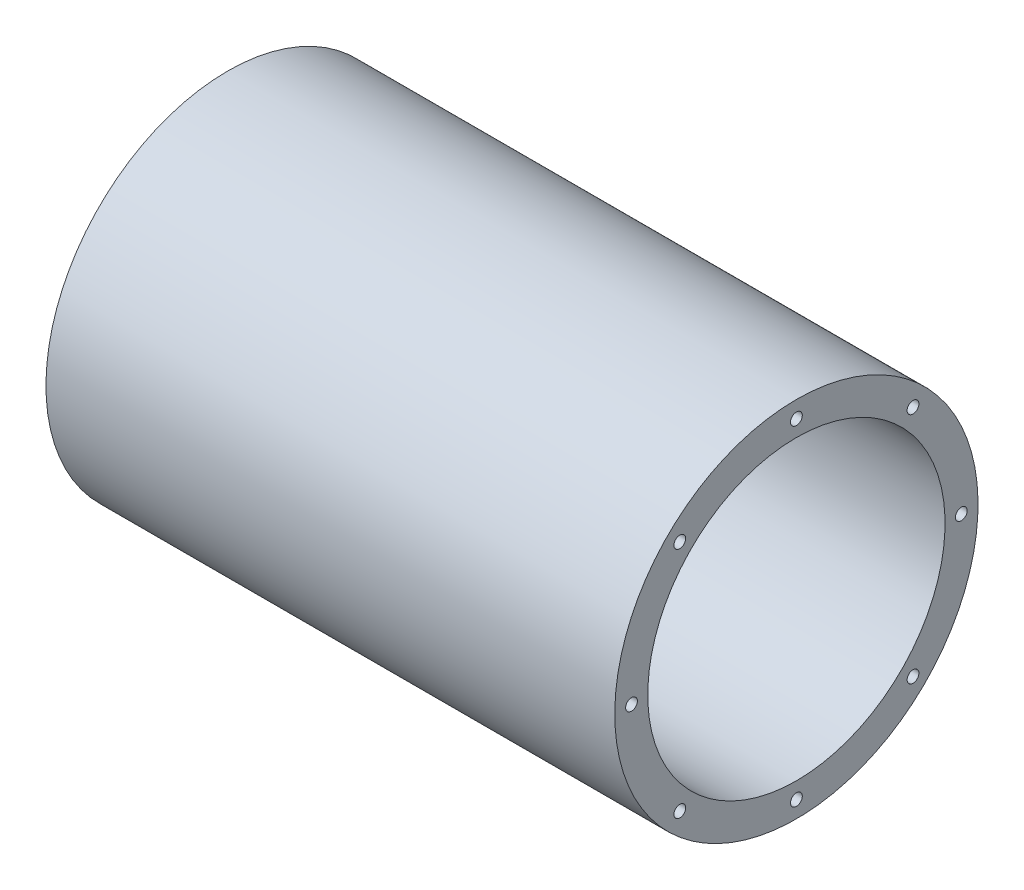
ISO-10303-21;
HEADER;
FILE_DESCRIPTION(('STEP AP214'),'2;1');
FILE_NAME('part.step','',(''),(''),'','','');
FILE_SCHEMA(('AUTOMOTIVE_DESIGN { 1 0 10303 214 1 1 1 1 }'));
ENDSEC;
DATA;
#1=APPLICATION_CONTEXT('core data for automotive mechanical design processes');
#2=APPLICATION_PROTOCOL_DEFINITION('international standard','automotive_design',2000,#1);
#3=PRODUCT_CONTEXT('',#1,'mechanical');
#4=PRODUCT('Part','Part','',(#3));
#5=PRODUCT_RELATED_PRODUCT_CATEGORY('part','',(#4));
#6=PRODUCT_DEFINITION_FORMATION('','',#4);
#7=PRODUCT_DEFINITION_CONTEXT('part definition',#1,'design');
#8=PRODUCT_DEFINITION('design','',#6,#7);
#9=PRODUCT_DEFINITION_SHAPE('','',#8);
#10=(LENGTH_UNIT() NAMED_UNIT(*) SI_UNIT(.MILLI.,.METRE.));
#11=(NAMED_UNIT(*) PLANE_ANGLE_UNIT() SI_UNIT($,.RADIAN.));
#12=(NAMED_UNIT(*) SI_UNIT($,.STERADIAN.) SOLID_ANGLE_UNIT());
#13=UNCERTAINTY_MEASURE_WITH_UNIT(LENGTH_MEASURE(1.E-05),#10,'distance_accuracy_value','');
#14=(GEOMETRIC_REPRESENTATION_CONTEXT(3) GLOBAL_UNCERTAINTY_ASSIGNED_CONTEXT((#13)) GLOBAL_UNIT_ASSIGNED_CONTEXT((#10,
#11,#12)) REPRESENTATION_CONTEXT('',''));
#15=CARTESIAN_POINT('',(0.,0.,0.));
#16=DIRECTION('',(0.,0.,1.));
#17=DIRECTION('',(1.,0.,0.));
#18=AXIS2_PLACEMENT_3D('',#15,#16,#17);
#19=CARTESIAN_POINT('',(111.000000000672,-24.3951839509359,24.3951839509359));
#20=DIRECTION('',(1.,0.,0.));
#21=DIRECTION('',(0.,1.,0.));
#22=AXIS2_PLACEMENT_3D('',#19,#20,#21);
#23=CONICAL_SURFACE('',#22,1.22949999943191,1.02974425737224);
#24=CARTESIAN_POINT('',(110.261241867875,-24.3951839509359,24.3951839510146));
#25=VERTEX_POINT('',#24);
#26=VERTEX_LOOP('',#25);
#27=FACE_BOUND('',#26,.T.);
#28=CARTESIAN_POINT('',(111.,-24.3951839509359,24.3951839509359));
#29=DIRECTION('',(1.,0.,0.));
#30=DIRECTION('',(0.,1.,0.));
#31=AXIS2_PLACEMENT_3D('',#28,#29,#30);
#32=CIRCLE('',#31,1.2295);
#33=CARTESIAN_POINT('',(111.,-23.1656839509359,24.3951839509359));
#34=VERTEX_POINT('',#33);
#35=EDGE_CURVE('E80',#34,#34,#32,.T.);
#36=ORIENTED_EDGE('',*,*,#35,.T.);
#37=EDGE_LOOP('',(#36));
#38=FACE_BOUND('',#37,.T.);
#39=ADVANCED_FACE('F17',(#27,#38),#23,.F.);
#40=CARTESIAN_POINT('',(111.000000000615,0.,34.5));
#41=DIRECTION('',(1.,0.,0.));
#42=DIRECTION('',(0.,0.,-1.));
#43=AXIS2_PLACEMENT_3D('',#40,#41,#42);
#44=CONICAL_SURFACE('',#43,1.22949999936009,1.02974425730025);
#45=CARTESIAN_POINT('',(110.261241867818,0.,34.5000000001505));
#46=VERTEX_POINT('',#45);
#47=VERTEX_LOOP('',#46);
#48=FACE_BOUND('',#47,.T.);
#49=CARTESIAN_POINT('',(111.,0.,34.5));
#50=DIRECTION('',(1.,0.,0.));
#51=DIRECTION('',(0.,1.,0.));
#52=AXIS2_PLACEMENT_3D('',#49,#50,#51);
#53=CIRCLE('',#52,1.2295);
#54=CARTESIAN_POINT('',(111.,1.22950000000002,34.5));
#55=VERTEX_POINT('',#54);
#56=EDGE_CURVE('E82',#55,#55,#53,.T.);
#57=ORIENTED_EDGE('',*,*,#56,.T.);
#58=EDGE_LOOP('',(#57));
#59=FACE_BOUND('',#58,.T.);
#60=ADVANCED_FACE('F77',(#48,#59),#44,.F.);
#61=CARTESIAN_POINT('',(111.000000000672,24.3951839509359,24.3951839509359));
#62=DIRECTION('',(1.,0.,0.));
#63=DIRECTION('',(0.,0.,-1.));
#64=AXIS2_PLACEMENT_3D('',#61,#62,#63);
#65=CONICAL_SURFACE('',#64,1.22949999943192,1.02974425737224);
#66=CARTESIAN_POINT('',(110.261241867875,24.3951839509359,24.3951839510146));
#67=VERTEX_POINT('',#66);
#68=VERTEX_LOOP('',#67);
#69=FACE_BOUND('',#68,.T.);
#70=CARTESIAN_POINT('',(111.,24.3951839509359,24.3951839509359));
#71=DIRECTION('',(1.,0.,0.));
#72=DIRECTION('',(0.,1.,0.));
#73=AXIS2_PLACEMENT_3D('',#70,#71,#72);
#74=CIRCLE('',#73,1.2295);
#75=CARTESIAN_POINT('',(111.,25.6246839509359,24.3951839509359));
#76=VERTEX_POINT('',#75);
#77=EDGE_CURVE('E85',#76,#76,#74,.T.);
#78=ORIENTED_EDGE('',*,*,#77,.T.);
#79=EDGE_LOOP('',(#78));
#80=FACE_BOUND('',#79,.T.);
#81=ADVANCED_FACE('F221',(#69,#80),#65,.F.);
#82=CARTESIAN_POINT('',(111.000000000729,34.5,0.));
#83=DIRECTION('',(1.,0.,0.));
#84=DIRECTION('',(0.,0.,-1.));
#85=AXIS2_PLACEMENT_3D('',#82,#83,#84);
#86=CONICAL_SURFACE('',#85,1.2294999996243,1.02974425750354);
#87=CARTESIAN_POINT('',(110.261241867931,34.5,-5.6843418860808E-11));
#88=VERTEX_POINT('',#87);
#89=VERTEX_LOOP('',#88);
#90=FACE_BOUND('',#89,.T.);
#91=CARTESIAN_POINT('',(111.,34.5,0.));
#92=DIRECTION('',(1.,0.,0.));
#93=DIRECTION('',(0.,1.,0.));
#94=AXIS2_PLACEMENT_3D('',#91,#92,#93);
#95=CIRCLE('',#94,1.2295);
#96=CARTESIAN_POINT('',(111.,35.7295,0.));
#97=VERTEX_POINT('',#96);
#98=EDGE_CURVE('E209',#97,#97,#95,.T.);
#99=ORIENTED_EDGE('',*,*,#98,.T.);
#100=EDGE_LOOP('',(#99));
#101=FACE_BOUND('',#100,.T.);
#102=ADVANCED_FACE('F357',(#90,#101),#86,.F.);
#103=CARTESIAN_POINT('',(111.000000000672,24.3951839509359,-24.3951839509359));
#104=DIRECTION('',(1.,0.,0.));
#105=DIRECTION('',(0.,0.,-1.));
#106=AXIS2_PLACEMENT_3D('',#103,#104,#105);
#107=CONICAL_SURFACE('',#106,1.22949999947562,1.02974425741719);
#108=CARTESIAN_POINT('',(110.261241867931,24.3951839509359,-24.3951839509009));
#109=VERTEX_POINT('',#108);
#110=VERTEX_LOOP('',#109);
#111=FACE_BOUND('',#110,.T.);
#112=CARTESIAN_POINT('',(111.,24.3951839509359,-24.3951839509359));
#113=DIRECTION('',(1.,0.,0.));
#114=DIRECTION('',(0.,1.,0.));
#115=AXIS2_PLACEMENT_3D('',#112,#113,#114);
#116=CIRCLE('',#115,1.2295);
#117=CARTESIAN_POINT('',(111.,25.6246839509359,-24.3951839509359));
#118=VERTEX_POINT('',#117);
#119=EDGE_CURVE('E204',#118,#118,#116,.T.);
#120=ORIENTED_EDGE('',*,*,#119,.T.);
#121=EDGE_LOOP('',(#120));
#122=FACE_BOUND('',#121,.T.);
#123=ADVANCED_FACE('F353',(#111,#122),#107,.F.);
#124=CARTESIAN_POINT('',(111.000000000615,0.,-34.5));
#125=DIRECTION('',(1.,0.,0.));
#126=DIRECTION('',(0.,0.,-1.));
#127=AXIS2_PLACEMENT_3D('',#124,#125,#126);
#128=CONICAL_SURFACE('',#127,1.22949999943375,1.02974425725795);
#129=CARTESIAN_POINT('',(110.261241867818,0.,-34.4999999998095));
#130=VERTEX_POINT('',#129);
#131=VERTEX_LOOP('',#130);
#132=FACE_BOUND('',#131,.T.);
#133=CARTESIAN_POINT('',(111.,0.,-34.5));
#134=DIRECTION('',(1.,0.,0.));
#135=DIRECTION('',(0.,1.,0.));
#136=AXIS2_PLACEMENT_3D('',#133,#134,#135);
#137=CIRCLE('',#136,1.2295);
#138=CARTESIAN_POINT('',(111.,1.22950000000002,-34.5));
#139=VERTEX_POINT('',#138);
#140=EDGE_CURVE('E199',#139,#139,#137,.T.);
#141=ORIENTED_EDGE('',*,*,#140,.T.);
#142=EDGE_LOOP('',(#141));
#143=FACE_BOUND('',#142,.T.);
#144=ADVANCED_FACE('F349',(#132,#143),#128,.F.);
#145=CARTESIAN_POINT('',(111.000000000672,-24.3951839509359,-24.3951839509359));
#146=DIRECTION('',(1.,0.,0.));
#147=DIRECTION('',(0.,1.,0.));
#148=AXIS2_PLACEMENT_3D('',#145,#146,#147);
#149=CONICAL_SURFACE('',#148,1.22949999947561,1.02974425741718);
#150=CARTESIAN_POINT('',(110.261241867931,-24.3951839509359,-24.3951839509009));
#151=VERTEX_POINT('',#150);
#152=VERTEX_LOOP('',#151);
#153=FACE_BOUND('',#152,.T.);
#154=CARTESIAN_POINT('',(111.,-24.3951839509359,-24.3951839509359));
#155=DIRECTION('',(1.,0.,0.));
#156=DIRECTION('',(0.,1.,0.));
#157=AXIS2_PLACEMENT_3D('',#154,#155,#156);
#158=CIRCLE('',#157,1.2295);
#159=CARTESIAN_POINT('',(111.,-23.1656839509359,-24.3951839509359));
#160=VERTEX_POINT('',#159);
#161=EDGE_CURVE('E194',#160,#160,#158,.T.);
#162=ORIENTED_EDGE('',*,*,#161,.T.);
#163=EDGE_LOOP('',(#162));
#164=FACE_BOUND('',#163,.T.);
#165=ADVANCED_FACE('F345',(#153,#164),#149,.F.);
#166=CARTESIAN_POINT('',(111.000000000729,-34.5,0.));
#167=DIRECTION('',(1.,0.,0.));
#168=DIRECTION('',(0.,0.,-1.));
#169=AXIS2_PLACEMENT_3D('',#166,#167,#168);
#170=CONICAL_SURFACE('',#169,1.22949999962429,1.02974425750355);
#171=CARTESIAN_POINT('',(110.261241867931,-34.5,-5.6843418860808E-11));
#172=VERTEX_POINT('',#171);
#173=VERTEX_LOOP('',#172);
#174=FACE_BOUND('',#173,.T.);
#175=CARTESIAN_POINT('',(111.,-34.5,0.));
#176=DIRECTION('',(1.,0.,0.));
#177=DIRECTION('',(0.,1.,0.));
#178=AXIS2_PLACEMENT_3D('',#175,#176,#177);
#179=CIRCLE('',#178,1.2295);
#180=CARTESIAN_POINT('',(111.,-33.2705,0.));
#181=VERTEX_POINT('',#180);
#182=EDGE_CURVE('E189',#181,#181,#179,.T.);
#183=ORIENTED_EDGE('',*,*,#182,.T.);
#184=EDGE_LOOP('',(#183));
#185=FACE_BOUND('',#184,.T.);
#186=ADVANCED_FACE('F341',(#174,#185),#170,.F.);
#187=CARTESIAN_POINT('',(7.99999999935608,-24.3951839509359,24.3951839509359));
#188=DIRECTION('',(-1.,0.,0.));
#189=DIRECTION('',(0.,0.,1.));
#190=AXIS2_PLACEMENT_3D('',#187,#188,#189);
#191=CONICAL_SURFACE('',#190,1.22949999941878,1.02974425739678);
#192=CARTESIAN_POINT('',(8.73875813209679,-24.3951839509359,24.3951839509009));
#193=VERTEX_POINT('',#192);
#194=VERTEX_LOOP('',#193);
#195=FACE_BOUND('',#194,.T.);
#196=CARTESIAN_POINT('',(8.00000000000001,-24.3951839509359,24.3951839509359));
#197=DIRECTION('',(-1.,0.,0.));
#198=DIRECTION('',(0.,-1.,0.));
#199=AXIS2_PLACEMENT_3D('',#196,#197,#198);
#200=CIRCLE('',#199,1.2295);
#201=CARTESIAN_POINT('',(8.00000000000001,-25.6246839509359,24.3951839509359));
#202=VERTEX_POINT('',#201);
#203=EDGE_CURVE('E184',#202,#202,#200,.T.);
#204=ORIENTED_EDGE('',*,*,#203,.T.);
#205=EDGE_LOOP('',(#204));
#206=FACE_BOUND('',#205,.T.);
#207=ADVANCED_FACE('F337',(#195,#206),#191,.F.);
#208=CARTESIAN_POINT('',(7.99999999929923,-34.5,0.));
#209=DIRECTION('',(-1.,0.,0.));
#210=DIRECTION('',(0.,0.,1.));
#211=AXIS2_PLACEMENT_3D('',#208,#209,#210);
#212=CONICAL_SURFACE('',#211,1.22949999945377,1.02974425734712);
#213=CARTESIAN_POINT('',(8.73875813209679,-34.5,-1.13686837721616E-10));
#214=VERTEX_POINT('',#213);
#215=VERTEX_LOOP('',#214);
#216=FACE_BOUND('',#215,.T.);
#217=CARTESIAN_POINT('',(8.00000000000001,-34.5,0.));
#218=DIRECTION('',(-1.,0.,0.));
#219=DIRECTION('',(0.,-1.,0.));
#220=AXIS2_PLACEMENT_3D('',#217,#218,#219);
#221=CIRCLE('',#220,1.2295);
#222=CARTESIAN_POINT('',(8.00000000000001,-35.7295,0.));
#223=VERTEX_POINT('',#222);
#224=EDGE_CURVE('E179',#223,#223,#221,.T.);
#225=ORIENTED_EDGE('',*,*,#224,.T.);
#226=EDGE_LOOP('',(#225));
#227=FACE_BOUND('',#226,.T.);
#228=ADVANCED_FACE('F333',(#216,#227),#212,.F.);
#229=CARTESIAN_POINT('',(7.99999999935608,-24.3951839509359,-24.3951839509359));
#230=DIRECTION('',(-1.,0.,0.));
#231=DIRECTION('',(0.,0.,1.));
#232=AXIS2_PLACEMENT_3D('',#229,#230,#231);
#233=CONICAL_SURFACE('',#232,1.22949999943192,1.02974425729745);
#234=CARTESIAN_POINT('',(8.73875813221048,-24.3951839509359,-24.3951839511283));
#235=VERTEX_POINT('',#234);
#236=VERTEX_LOOP('',#235);
#237=FACE_BOUND('',#236,.T.);
#238=CARTESIAN_POINT('',(8.00000000000001,-24.3951839509359,-24.3951839509359));
#239=DIRECTION('',(-1.,0.,0.));
#240=DIRECTION('',(0.,-1.,0.));
#241=AXIS2_PLACEMENT_3D('',#238,#239,#240);
#242=CIRCLE('',#241,1.2295);
#243=CARTESIAN_POINT('',(8.00000000000001,-25.6246839509359,-24.3951839509359));
#244=VERTEX_POINT('',#243);
#245=EDGE_CURVE('E174',#244,#244,#242,.T.);
#246=ORIENTED_EDGE('',*,*,#245,.T.);
#247=EDGE_LOOP('',(#246));
#248=FACE_BOUND('',#247,.T.);
#249=ADVANCED_FACE('F329',(#237,#248),#233,.F.);
#250=CARTESIAN_POINT('',(7.99999999918555,0.,-34.5));
#251=DIRECTION('',(-1.,0.,0.));
#252=DIRECTION('',(0.,0.,1.));
#253=AXIS2_PLACEMENT_3D('',#250,#251,#252);
#254=CONICAL_SURFACE('',#253,1.22949999964431,1.02974425751025);
#255=CARTESIAN_POINT('',(8.7387581319831,0.,-34.4999999999231));
#256=VERTEX_POINT('',#255);
#257=VERTEX_LOOP('',#256);
#258=FACE_BOUND('',#257,.T.);
#259=CARTESIAN_POINT('',(8.00000000000001,0.,-34.5));
#260=DIRECTION('',(-1.,0.,0.));
#261=DIRECTION('',(0.,-1.,0.));
#262=AXIS2_PLACEMENT_3D('',#259,#260,#261);
#263=CIRCLE('',#262,1.2295);
#264=CARTESIAN_POINT('',(8.00000000000001,-1.22949999999999,-34.5));
#265=VERTEX_POINT('',#264);
#266=EDGE_CURVE('E169',#265,#265,#263,.T.);
#267=ORIENTED_EDGE('',*,*,#266,.T.);
#268=EDGE_LOOP('',(#267));
#269=FACE_BOUND('',#268,.T.);
#270=ADVANCED_FACE('F325',(#258,#269),#254,.F.);
#271=CARTESIAN_POINT('',(7.99999999935608,24.3951839509359,-24.3951839509359));
#272=DIRECTION('',(-1.,0.,0.));
#273=DIRECTION('',(0.,0.,1.));
#274=AXIS2_PLACEMENT_3D('',#271,#272,#273);
#275=CONICAL_SURFACE('',#274,1.22949999943191,1.02974425729745);
#276=CARTESIAN_POINT('',(8.73875813221048,24.3951839509359,-24.3951839511283));
#277=VERTEX_POINT('',#276);
#278=VERTEX_LOOP('',#277);
#279=FACE_BOUND('',#278,.T.);
#280=CARTESIAN_POINT('',(8.,24.3951839509359,-24.3951839509359));
#281=DIRECTION('',(-1.,0.,0.));
#282=DIRECTION('',(0.,-1.,0.));
#283=AXIS2_PLACEMENT_3D('',#280,#281,#282);
#284=CIRCLE('',#283,1.2295);
#285=CARTESIAN_POINT('',(8.,23.1656839509359,-24.3951839509359));
#286=VERTEX_POINT('',#285);
#287=EDGE_CURVE('E164',#286,#286,#284,.T.);
#288=ORIENTED_EDGE('',*,*,#287,.T.);
#289=EDGE_LOOP('',(#288));
#290=FACE_BOUND('',#289,.T.);
#291=ADVANCED_FACE('F321',(#279,#290),#275,.F.);
#292=CARTESIAN_POINT('',(7.99999999929923,34.5,0.));
#293=DIRECTION('',(-1.,0.,0.));
#294=DIRECTION('',(0.,0.,1.));
#295=AXIS2_PLACEMENT_3D('',#292,#293,#294);
#296=CONICAL_SURFACE('',#295,1.22949999945376,1.0297442574219);
#297=CARTESIAN_POINT('',(8.73875813203995,34.5,-5.6843418860808E-11));
#298=VERTEX_POINT('',#297);
#299=VERTEX_LOOP('',#298);
#300=FACE_BOUND('',#299,.T.);
#301=CARTESIAN_POINT('',(8.,34.5,0.));
#302=DIRECTION('',(-1.,0.,0.));
#303=DIRECTION('',(0.,-1.,0.));
#304=AXIS2_PLACEMENT_3D('',#301,#302,#303);
#305=CIRCLE('',#304,1.2295);
#306=CARTESIAN_POINT('',(8.,33.2705,0.));
#307=VERTEX_POINT('',#306);
#308=EDGE_CURVE('E155',#307,#307,#305,.T.);
#309=ORIENTED_EDGE('',*,*,#308,.T.);
#310=EDGE_LOOP('',(#309));
#311=FACE_BOUND('',#310,.T.);
#312=ADVANCED_FACE('F317',(#300,#311),#296,.F.);
#313=CARTESIAN_POINT('',(7.99999999935608,24.3951839509359,24.3951839509359));
#314=DIRECTION('',(-1.,0.,0.));
#315=DIRECTION('',(0.,0.,1.));
#316=AXIS2_PLACEMENT_3D('',#313,#314,#315);
#317=CONICAL_SURFACE('',#316,1.22949999941877,1.02974425739677);
#318=CARTESIAN_POINT('',(8.73875813209679,24.3951839509359,24.3951839509009));
#319=VERTEX_POINT('',#318);
#320=VERTEX_LOOP('',#319);
#321=FACE_BOUND('',#320,.T.);
#322=CARTESIAN_POINT('',(8.,24.3951839509359,24.3951839509359));
#323=DIRECTION('',(-1.,0.,0.));
#324=DIRECTION('',(0.,-1.,0.));
#325=AXIS2_PLACEMENT_3D('',#322,#323,#324);
#326=CIRCLE('',#325,1.2295);
#327=CARTESIAN_POINT('',(8.,23.1656839509359,24.3951839509359));
#328=VERTEX_POINT('',#327);
#329=EDGE_CURVE('E150',#328,#328,#326,.T.);
#330=ORIENTED_EDGE('',*,*,#329,.T.);
#331=EDGE_LOOP('',(#330));
#332=FACE_BOUND('',#331,.T.);
#333=ADVANCED_FACE('F314',(#321,#332),#317,.F.);
#334=CARTESIAN_POINT('',(7.99999999918555,0.,34.5));
#335=DIRECTION('',(-1.,0.,0.));
#336=DIRECTION('',(0.,0.,1.));
#337=AXIS2_PLACEMENT_3D('',#334,#335,#336);
#338=CONICAL_SURFACE('',#337,1.22949999960428,1.02974425746272);
#339=CARTESIAN_POINT('',(8.73875813203995,0.,34.5000000000368));
#340=VERTEX_POINT('',#339);
#341=VERTEX_LOOP('',#340);
#342=FACE_BOUND('',#341,.T.);
#343=CARTESIAN_POINT('',(8.00000000000001,0.,34.5));
#344=DIRECTION('',(-1.,0.,0.));
#345=DIRECTION('',(0.,-1.,0.));
#346=AXIS2_PLACEMENT_3D('',#343,#344,#345);
#347=CIRCLE('',#346,1.2295);
#348=CARTESIAN_POINT('',(8.00000000000001,-1.2295,34.5));
#349=VERTEX_POINT('',#348);
#350=EDGE_CURVE('E146',#349,#349,#347,.T.);
#351=ORIENTED_EDGE('',*,*,#350,.T.);
#352=EDGE_LOOP('',(#351));
#353=FACE_BOUND('',#352,.T.);
#354=ADVANCED_FACE('F311',(#342,#353),#338,.F.);
#355=CARTESIAN_POINT('',(115.,-24.3951839509359,24.3951839509359));
#356=DIRECTION('',(1.,0.,0.));
#357=DIRECTION('',(0.,1.,0.));
#358=AXIS2_PLACEMENT_3D('',#355,#356,#357);
#359=CYLINDRICAL_SURFACE('',#358,1.2295);
#360=ORIENTED_EDGE('',*,*,#35,.F.);
#361=EDGE_LOOP('',(#360));
#362=FACE_BOUND('',#361,.T.);
#363=CARTESIAN_POINT('',(119.,-24.3951839509359,24.3951839509359));
#364=DIRECTION('',(1.,0.,0.));
#365=DIRECTION('',(0.,1.,0.));
#366=AXIS2_PLACEMENT_3D('',#363,#364,#365);
#367=CIRCLE('',#366,1.2295);
#368=CARTESIAN_POINT('',(119.,-23.1656839509359,24.3951839509359));
#369=VERTEX_POINT('',#368);
#370=EDGE_CURVE('E20',#369,#369,#367,.F.);
#371=ORIENTED_EDGE('',*,*,#370,.F.);
#372=EDGE_LOOP('',(#371));
#373=FACE_BOUND('',#372,.T.);
#374=ADVANCED_FACE('F307',(#362,#373),#359,.F.);
#375=CARTESIAN_POINT('',(115.,0.,34.5));
#376=DIRECTION('',(1.,0.,0.));
#377=DIRECTION('',(0.,1.,0.));
#378=AXIS2_PLACEMENT_3D('',#375,#376,#377);
#379=CYLINDRICAL_SURFACE('',#378,1.2295);
#380=ORIENTED_EDGE('',*,*,#56,.F.);
#381=EDGE_LOOP('',(#380));
#382=FACE_BOUND('',#381,.T.);
#383=CARTESIAN_POINT('',(119.,0.,34.5));
#384=DIRECTION('',(1.,0.,0.));
#385=DIRECTION('',(0.,1.,0.));
#386=AXIS2_PLACEMENT_3D('',#383,#384,#385);
#387=CIRCLE('',#386,1.2295);
#388=CARTESIAN_POINT('',(119.,1.22950000000002,34.5));
#389=VERTEX_POINT('',#388);
#390=EDGE_CURVE('E141',#389,#389,#387,.F.);
#391=ORIENTED_EDGE('',*,*,#390,.F.);
#392=EDGE_LOOP('',(#391));
#393=FACE_BOUND('',#392,.T.);
#394=ADVANCED_FACE('F227',(#382,#393),#379,.F.);
#395=CARTESIAN_POINT('',(115.,24.3951839509359,24.3951839509359));
#396=DIRECTION('',(1.,0.,0.));
#397=DIRECTION('',(0.,1.,0.));
#398=AXIS2_PLACEMENT_3D('',#395,#396,#397);
#399=CYLINDRICAL_SURFACE('',#398,1.2295);
#400=ORIENTED_EDGE('',*,*,#77,.F.);
#401=EDGE_LOOP('',(#400));
#402=FACE_BOUND('',#401,.T.);
#403=CARTESIAN_POINT('',(119.,24.3951839509359,24.3951839509359));
#404=DIRECTION('',(1.,0.,0.));
#405=DIRECTION('',(0.,1.,0.));
#406=AXIS2_PLACEMENT_3D('',#403,#404,#405);
#407=CIRCLE('',#406,1.2295);
#408=CARTESIAN_POINT('',(119.,25.6246839509359,24.3951839509359));
#409=VERTEX_POINT('',#408);
#410=EDGE_CURVE('E139',#409,#409,#407,.F.);
#411=ORIENTED_EDGE('',*,*,#410,.F.);
#412=EDGE_LOOP('',(#411));
#413=FACE_BOUND('',#412,.T.);
#414=ADVANCED_FACE('F223',(#402,#413),#399,.F.);
#415=CARTESIAN_POINT('',(115.,34.5,0.));
#416=DIRECTION('',(1.,0.,0.));
#417=DIRECTION('',(0.,1.,0.));
#418=AXIS2_PLACEMENT_3D('',#415,#416,#417);
#419=CYLINDRICAL_SURFACE('',#418,1.2295);
#420=ORIENTED_EDGE('',*,*,#98,.F.);
#421=EDGE_LOOP('',(#420));
#422=FACE_BOUND('',#421,.T.);
#423=CARTESIAN_POINT('',(119.,34.5,0.));
#424=DIRECTION('',(1.,0.,0.));
#425=DIRECTION('',(0.,1.,0.));
#426=AXIS2_PLACEMENT_3D('',#423,#424,#425);
#427=CIRCLE('',#426,1.2295);
#428=CARTESIAN_POINT('',(119.,35.7295,0.));
#429=VERTEX_POINT('',#428);
#430=EDGE_CURVE('E136',#429,#429,#427,.F.);
#431=ORIENTED_EDGE('',*,*,#430,.F.);
#432=EDGE_LOOP('',(#431));
#433=FACE_BOUND('',#432,.T.);
#434=ADVANCED_FACE('F226',(#422,#433),#419,.F.);
#435=CARTESIAN_POINT('',(115.,24.3951839509359,-24.3951839509359));
#436=DIRECTION('',(1.,0.,0.));
#437=DIRECTION('',(0.,1.,0.));
#438=AXIS2_PLACEMENT_3D('',#435,#436,#437);
#439=CYLINDRICAL_SURFACE('',#438,1.2295);
#440=ORIENTED_EDGE('',*,*,#119,.F.);
#441=EDGE_LOOP('',(#440));
#442=FACE_BOUND('',#441,.T.);
#443=CARTESIAN_POINT('',(119.,24.3951839509359,-24.3951839509359));
#444=DIRECTION('',(1.,0.,0.));
#445=DIRECTION('',(0.,1.,0.));
#446=AXIS2_PLACEMENT_3D('',#443,#444,#445);
#447=CIRCLE('',#446,1.2295);
#448=CARTESIAN_POINT('',(119.,25.6246839509359,-24.3951839509359));
#449=VERTEX_POINT('',#448);
#450=EDGE_CURVE('E133',#449,#449,#447,.F.);
#451=ORIENTED_EDGE('',*,*,#450,.F.);
#452=EDGE_LOOP('',(#451));
#453=FACE_BOUND('',#452,.T.);
#454=ADVANCED_FACE('F297',(#442,#453),#439,.F.);
#455=CARTESIAN_POINT('',(115.,0.,-34.5));
#456=DIRECTION('',(1.,0.,0.));
#457=DIRECTION('',(0.,1.,0.));
#458=AXIS2_PLACEMENT_3D('',#455,#456,#457);
#459=CYLINDRICAL_SURFACE('',#458,1.2295);
#460=ORIENTED_EDGE('',*,*,#140,.F.);
#461=EDGE_LOOP('',(#460));
#462=FACE_BOUND('',#461,.T.);
#463=CARTESIAN_POINT('',(119.,0.,-34.5));
#464=DIRECTION('',(1.,0.,0.));
#465=DIRECTION('',(0.,1.,0.));
#466=AXIS2_PLACEMENT_3D('',#463,#464,#465);
#467=CIRCLE('',#466,1.2295);
#468=CARTESIAN_POINT('',(119.,1.22950000000002,-34.5));
#469=VERTEX_POINT('',#468);
#470=EDGE_CURVE('E130',#469,#469,#467,.F.);
#471=ORIENTED_EDGE('',*,*,#470,.F.);
#472=EDGE_LOOP('',(#471));
#473=FACE_BOUND('',#472,.T.);
#474=ADVANCED_FACE('F293',(#462,#473),#459,.F.);
#475=CARTESIAN_POINT('',(115.,-24.3951839509359,-24.3951839509359));
#476=DIRECTION('',(1.,0.,0.));
#477=DIRECTION('',(0.,1.,0.));
#478=AXIS2_PLACEMENT_3D('',#475,#476,#477);
#479=CYLINDRICAL_SURFACE('',#478,1.2295);
#480=ORIENTED_EDGE('',*,*,#161,.F.);
#481=EDGE_LOOP('',(#480));
#482=FACE_BOUND('',#481,.T.);
#483=CARTESIAN_POINT('',(119.,-24.3951839509359,-24.3951839509359));
#484=DIRECTION('',(1.,0.,0.));
#485=DIRECTION('',(0.,1.,0.));
#486=AXIS2_PLACEMENT_3D('',#483,#484,#485);
#487=CIRCLE('',#486,1.2295);
#488=CARTESIAN_POINT('',(119.,-23.1656839509359,-24.3951839509359));
#489=VERTEX_POINT('',#488);
#490=EDGE_CURVE('E127',#489,#489,#487,.F.);
#491=ORIENTED_EDGE('',*,*,#490,.F.);
#492=EDGE_LOOP('',(#491));
#493=FACE_BOUND('',#492,.T.);
#494=ADVANCED_FACE('F289',(#482,#493),#479,.F.);
#495=CARTESIAN_POINT('',(115.,-34.5,0.));
#496=DIRECTION('',(1.,0.,0.));
#497=DIRECTION('',(0.,1.,0.));
#498=AXIS2_PLACEMENT_3D('',#495,#496,#497);
#499=CYLINDRICAL_SURFACE('',#498,1.2295);
#500=ORIENTED_EDGE('',*,*,#182,.F.);
#501=EDGE_LOOP('',(#500));
#502=FACE_BOUND('',#501,.T.);
#503=CARTESIAN_POINT('',(119.,-34.5,0.));
#504=DIRECTION('',(1.,0.,0.));
#505=DIRECTION('',(0.,1.,0.));
#506=AXIS2_PLACEMENT_3D('',#503,#504,#505);
#507=CIRCLE('',#506,1.2295);
#508=CARTESIAN_POINT('',(119.,-33.2705,0.));
#509=VERTEX_POINT('',#508);
#510=EDGE_CURVE('E124',#509,#509,#507,.F.);
#511=ORIENTED_EDGE('',*,*,#510,.F.);
#512=EDGE_LOOP('',(#511));
#513=FACE_BOUND('',#512,.T.);
#514=ADVANCED_FACE('F285',(#502,#513),#499,.F.);
#515=CARTESIAN_POINT('',(4.00000000000001,-24.3951839509359,24.3951839509359));
#516=DIRECTION('',(-1.,0.,0.));
#517=DIRECTION('',(0.,-1.,0.));
#518=AXIS2_PLACEMENT_3D('',#515,#516,#517);
#519=CYLINDRICAL_SURFACE('',#518,1.2295);
#520=ORIENTED_EDGE('',*,*,#203,.F.);
#521=EDGE_LOOP('',(#520));
#522=FACE_BOUND('',#521,.T.);
#523=CARTESIAN_POINT('',(0.,-24.3951839509359,24.3951839509359));
#524=DIRECTION('',(-1.,0.,0.));
#525=DIRECTION('',(0.,-1.,0.));
#526=AXIS2_PLACEMENT_3D('',#523,#524,#525);
#527=CIRCLE('',#526,1.2295);
#528=CARTESIAN_POINT('',(0.,-25.6246839509359,24.3951839509359));
#529=VERTEX_POINT('',#528);
#530=EDGE_CURVE('E118',#529,#529,#527,.F.);
#531=ORIENTED_EDGE('',*,*,#530,.F.);
#532=EDGE_LOOP('',(#531));
#533=FACE_BOUND('',#532,.T.);
#534=ADVANCED_FACE('F281',(#522,#533),#519,.F.);
#535=CARTESIAN_POINT('',(4.00000000000001,-34.5,0.));
#536=DIRECTION('',(-1.,0.,0.));
#537=DIRECTION('',(0.,-1.,0.));
#538=AXIS2_PLACEMENT_3D('',#535,#536,#537);
#539=CYLINDRICAL_SURFACE('',#538,1.2295);
#540=ORIENTED_EDGE('',*,*,#224,.F.);
#541=EDGE_LOOP('',(#540));
#542=FACE_BOUND('',#541,.T.);
#543=CARTESIAN_POINT('',(0.,-34.5,0.));
#544=DIRECTION('',(-1.,0.,0.));
#545=DIRECTION('',(0.,-1.,0.));
#546=AXIS2_PLACEMENT_3D('',#543,#544,#545);
#547=CIRCLE('',#546,1.2295);
#548=CARTESIAN_POINT('',(0.,-35.7295,0.));
#549=VERTEX_POINT('',#548);
#550=EDGE_CURVE('E115',#549,#549,#547,.F.);
#551=ORIENTED_EDGE('',*,*,#550,.F.);
#552=EDGE_LOOP('',(#551));
#553=FACE_BOUND('',#552,.T.);
#554=ADVANCED_FACE('F277',(#542,#553),#539,.F.);
#555=CARTESIAN_POINT('',(4.00000000000001,-24.3951839509359,-24.3951839509359));
#556=DIRECTION('',(-1.,0.,0.));
#557=DIRECTION('',(0.,-1.,0.));
#558=AXIS2_PLACEMENT_3D('',#555,#556,#557);
#559=CYLINDRICAL_SURFACE('',#558,1.2295);
#560=ORIENTED_EDGE('',*,*,#245,.F.);
#561=EDGE_LOOP('',(#560));
#562=FACE_BOUND('',#561,.T.);
#563=CARTESIAN_POINT('',(0.,-24.3951839509359,-24.3951839509359));
#564=DIRECTION('',(-1.,0.,0.));
#565=DIRECTION('',(0.,-1.,0.));
#566=AXIS2_PLACEMENT_3D('',#563,#564,#565);
#567=CIRCLE('',#566,1.2295);
#568=CARTESIAN_POINT('',(0.,-25.6246839509359,-24.3951839509359));
#569=VERTEX_POINT('',#568);
#570=EDGE_CURVE('E112',#569,#569,#567,.F.);
#571=ORIENTED_EDGE('',*,*,#570,.F.);
#572=EDGE_LOOP('',(#571));
#573=FACE_BOUND('',#572,.T.);
#574=ADVANCED_FACE('F273',(#562,#573),#559,.F.);
#575=CARTESIAN_POINT('',(4.00000000000001,0.,-34.5));
#576=DIRECTION('',(-1.,0.,0.));
#577=DIRECTION('',(0.,-1.,0.));
#578=AXIS2_PLACEMENT_3D('',#575,#576,#577);
#579=CYLINDRICAL_SURFACE('',#578,1.2295);
#580=ORIENTED_EDGE('',*,*,#266,.F.);
#581=EDGE_LOOP('',(#580));
#582=FACE_BOUND('',#581,.T.);
#583=CARTESIAN_POINT('',(0.,0.,-34.5));
#584=DIRECTION('',(-1.,0.,0.));
#585=DIRECTION('',(0.,-1.,0.));
#586=AXIS2_PLACEMENT_3D('',#583,#584,#585);
#587=CIRCLE('',#586,1.2295);
#588=CARTESIAN_POINT('',(0.,-1.2295,-34.5));
#589=VERTEX_POINT('',#588);
#590=EDGE_CURVE('E109',#589,#589,#587,.F.);
#591=ORIENTED_EDGE('',*,*,#590,.F.);
#592=EDGE_LOOP('',(#591));
#593=FACE_BOUND('',#592,.T.);
#594=ADVANCED_FACE('F269',(#582,#593),#579,.F.);
#595=CARTESIAN_POINT('',(4.,24.3951839509359,-24.3951839509359));
#596=DIRECTION('',(-1.,0.,0.));
#597=DIRECTION('',(0.,-1.,0.));
#598=AXIS2_PLACEMENT_3D('',#595,#596,#597);
#599=CYLINDRICAL_SURFACE('',#598,1.2295);
#600=ORIENTED_EDGE('',*,*,#287,.F.);
#601=EDGE_LOOP('',(#600));
#602=FACE_BOUND('',#601,.T.);
#603=CARTESIAN_POINT('',(0.,24.3951839509359,-24.3951839509359));
#604=DIRECTION('',(-1.,0.,0.));
#605=DIRECTION('',(0.,-1.,0.));
#606=AXIS2_PLACEMENT_3D('',#603,#604,#605);
#607=CIRCLE('',#606,1.2295);
#608=CARTESIAN_POINT('',(0.,23.1656839509359,-24.3951839509359));
#609=VERTEX_POINT('',#608);
#610=EDGE_CURVE('E106',#609,#609,#607,.F.);
#611=ORIENTED_EDGE('',*,*,#610,.F.);
#612=EDGE_LOOP('',(#611));
#613=FACE_BOUND('',#612,.T.);
#614=ADVANCED_FACE('F265',(#602,#613),#599,.F.);
#615=CARTESIAN_POINT('',(4.,34.5,0.));
#616=DIRECTION('',(-1.,0.,0.));
#617=DIRECTION('',(0.,-1.,0.));
#618=AXIS2_PLACEMENT_3D('',#615,#616,#617);
#619=CYLINDRICAL_SURFACE('',#618,1.2295);
#620=ORIENTED_EDGE('',*,*,#308,.F.);
#621=EDGE_LOOP('',(#620));
#622=FACE_BOUND('',#621,.T.);
#623=CARTESIAN_POINT('',(0.,34.5,0.));
#624=DIRECTION('',(-1.,0.,0.));
#625=DIRECTION('',(0.,-1.,0.));
#626=AXIS2_PLACEMENT_3D('',#623,#624,#625);
#627=CIRCLE('',#626,1.2295);
#628=CARTESIAN_POINT('',(0.,33.2705,0.));
#629=VERTEX_POINT('',#628);
#630=EDGE_CURVE('E103',#629,#629,#627,.F.);
#631=ORIENTED_EDGE('',*,*,#630,.F.);
#632=EDGE_LOOP('',(#631));
#633=FACE_BOUND('',#632,.T.);
#634=ADVANCED_FACE('F261',(#622,#633),#619,.F.);
#635=CARTESIAN_POINT('',(4.,24.3951839509359,24.3951839509359));
#636=DIRECTION('',(-1.,0.,0.));
#637=DIRECTION('',(0.,-1.,0.));
#638=AXIS2_PLACEMENT_3D('',#635,#636,#637);
#639=CYLINDRICAL_SURFACE('',#638,1.2295);
#640=ORIENTED_EDGE('',*,*,#329,.F.);
#641=EDGE_LOOP('',(#640));
#642=FACE_BOUND('',#641,.T.);
#643=CARTESIAN_POINT('',(0.,24.3951839509359,24.3951839509359));
#644=DIRECTION('',(-1.,0.,0.));
#645=DIRECTION('',(0.,-1.,0.));
#646=AXIS2_PLACEMENT_3D('',#643,#644,#645);
#647=CIRCLE('',#646,1.2295);
#648=CARTESIAN_POINT('',(0.,23.1656839509359,24.3951839509359));
#649=VERTEX_POINT('',#648);
#650=EDGE_CURVE('E100',#649,#649,#647,.F.);
#651=ORIENTED_EDGE('',*,*,#650,.F.);
#652=EDGE_LOOP('',(#651));
#653=FACE_BOUND('',#652,.T.);
#654=ADVANCED_FACE('F257',(#642,#653),#639,.F.);
#655=CARTESIAN_POINT('',(4.00000000000001,0.,34.5));
#656=DIRECTION('',(-1.,0.,0.));
#657=DIRECTION('',(0.,-1.,0.));
#658=AXIS2_PLACEMENT_3D('',#655,#656,#657);
#659=CYLINDRICAL_SURFACE('',#658,1.2295);
#660=ORIENTED_EDGE('',*,*,#350,.F.);
#661=EDGE_LOOP('',(#660));
#662=FACE_BOUND('',#661,.T.);
#663=CARTESIAN_POINT('',(0.,0.,34.5));
#664=DIRECTION('',(-1.,0.,0.));
#665=DIRECTION('',(0.,-1.,0.));
#666=AXIS2_PLACEMENT_3D('',#663,#664,#665);
#667=CIRCLE('',#666,1.2295);
#668=CARTESIAN_POINT('',(0.,-1.2295,34.5));
#669=VERTEX_POINT('',#668);
#670=EDGE_CURVE('E97',#669,#669,#667,.F.);
#671=ORIENTED_EDGE('',*,*,#670,.F.);
#672=EDGE_LOOP('',(#671));
#673=FACE_BOUND('',#672,.T.);
#674=ADVANCED_FACE('F253',(#662,#673),#659,.F.);
#675=CARTESIAN_POINT('',(59.5,0.,0.));
#676=DIRECTION('',(1.,0.,0.));
#677=DIRECTION('',(0.,1.,0.));
#678=AXIS2_PLACEMENT_3D('',#675,#676,#677);
#679=CYLINDRICAL_SURFACE('',#678,31.1);
#680=CARTESIAN_POINT('',(119.,0.,0.));
#681=DIRECTION('',(1.,0.,0.));
#682=DIRECTION('',(0.,1.,0.));
#683=AXIS2_PLACEMENT_3D('',#680,#681,#682);
#684=CIRCLE('',#683,31.1);
#685=CARTESIAN_POINT('',(119.,31.1,0.));
#686=VERTEX_POINT('',#685);
#687=EDGE_CURVE('E121',#686,#686,#684,.F.);
#688=ORIENTED_EDGE('',*,*,#687,.F.);
#689=EDGE_LOOP('',(#688));
#690=FACE_BOUND('',#689,.T.);
#691=CARTESIAN_POINT('',(0.,0.,0.));
#692=DIRECTION('',(1.,0.,0.));
#693=DIRECTION('',(0.,1.,0.));
#694=AXIS2_PLACEMENT_3D('',#691,#692,#693);
#695=CIRCLE('',#694,31.1);
#696=CARTESIAN_POINT('',(0.,31.1,0.));
#697=VERTEX_POINT('',#696);
#698=EDGE_CURVE('E94',#697,#697,#695,.T.);
#699=ORIENTED_EDGE('',*,*,#698,.F.);
#700=EDGE_LOOP('',(#699));
#701=FACE_BOUND('',#700,.T.);
#702=ADVANCED_FACE('F234',(#690,#701),#679,.F.);
#703=CARTESIAN_POINT('',(119.,34.55,0.));
#704=DIRECTION('',(1.,0.,0.));
#705=DIRECTION('',(0.,0.,-1.));
#706=AXIS2_PLACEMENT_3D('',#703,#704,#705);
#707=PLANE('',#706);
#708=ORIENTED_EDGE('',*,*,#687,.T.);
#709=EDGE_LOOP('',(#708));
#710=FACE_BOUND('',#709,.T.);
#711=ORIENTED_EDGE('',*,*,#510,.T.);
#712=EDGE_LOOP('',(#711));
#713=FACE_BOUND('',#712,.T.);
#714=ORIENTED_EDGE('',*,*,#490,.T.);
#715=EDGE_LOOP('',(#714));
#716=FACE_BOUND('',#715,.T.);
#717=ORIENTED_EDGE('',*,*,#470,.T.);
#718=EDGE_LOOP('',(#717));
#719=FACE_BOUND('',#718,.T.);
#720=ORIENTED_EDGE('',*,*,#450,.T.);
#721=EDGE_LOOP('',(#720));
#722=FACE_BOUND('',#721,.T.);
#723=ORIENTED_EDGE('',*,*,#430,.T.);
#724=EDGE_LOOP('',(#723));
#725=FACE_BOUND('',#724,.T.);
#726=ORIENTED_EDGE('',*,*,#410,.T.);
#727=EDGE_LOOP('',(#726));
#728=FACE_BOUND('',#727,.T.);
#729=ORIENTED_EDGE('',*,*,#390,.T.);
#730=EDGE_LOOP('',(#729));
#731=FACE_BOUND('',#730,.T.);
#732=ORIENTED_EDGE('',*,*,#370,.T.);
#733=EDGE_LOOP('',(#732));
#734=FACE_BOUND('',#733,.T.);
#735=CARTESIAN_POINT('',(119.,0.,0.));
#736=DIRECTION('',(1.,0.,0.));
#737=DIRECTION('',(0.,1.,0.));
#738=AXIS2_PLACEMENT_3D('',#735,#736,#737);
#739=CIRCLE('',#738,38.);
#740=CARTESIAN_POINT('',(119.,38.,0.));
#741=VERTEX_POINT('',#740);
#742=EDGE_CURVE('E26',#741,#741,#739,.F.);
#743=ORIENTED_EDGE('',*,*,#742,.F.);
#744=EDGE_LOOP('',(#743));
#745=FACE_BOUND('',#744,.T.);
#746=ADVANCED_FACE('F231',(#710,#713,#716,#719,#722,#725,#728,#731,#734,#745),#707,.T.);
#747=CARTESIAN_POINT('',(0.,34.55,0.));
#748=DIRECTION('',(-1.,0.,0.));
#749=DIRECTION('',(0.,0.,1.));
#750=AXIS2_PLACEMENT_3D('',#747,#748,#749);
#751=PLANE('',#750);
#752=ORIENTED_EDGE('',*,*,#698,.T.);
#753=EDGE_LOOP('',(#752));
#754=FACE_BOUND('',#753,.T.);
#755=ORIENTED_EDGE('',*,*,#670,.T.);
#756=EDGE_LOOP('',(#755));
#757=FACE_BOUND('',#756,.T.);
#758=ORIENTED_EDGE('',*,*,#650,.T.);
#759=EDGE_LOOP('',(#758));
#760=FACE_BOUND('',#759,.T.);
#761=ORIENTED_EDGE('',*,*,#630,.T.);
#762=EDGE_LOOP('',(#761));
#763=FACE_BOUND('',#762,.T.);
#764=ORIENTED_EDGE('',*,*,#610,.T.);
#765=EDGE_LOOP('',(#764));
#766=FACE_BOUND('',#765,.T.);
#767=ORIENTED_EDGE('',*,*,#590,.T.);
#768=EDGE_LOOP('',(#767));
#769=FACE_BOUND('',#768,.T.);
#770=ORIENTED_EDGE('',*,*,#570,.T.);
#771=EDGE_LOOP('',(#770));
#772=FACE_BOUND('',#771,.T.);
#773=ORIENTED_EDGE('',*,*,#550,.T.);
#774=EDGE_LOOP('',(#773));
#775=FACE_BOUND('',#774,.T.);
#776=ORIENTED_EDGE('',*,*,#530,.T.);
#777=EDGE_LOOP('',(#776));
#778=FACE_BOUND('',#777,.T.);
#779=CARTESIAN_POINT('',(0.,0.,0.));
#780=DIRECTION('',(1.,0.,0.));
#781=DIRECTION('',(0.,1.,0.));
#782=AXIS2_PLACEMENT_3D('',#779,#780,#781);
#783=CIRCLE('',#782,38.);
#784=CARTESIAN_POINT('',(0.,38.,0.));
#785=VERTEX_POINT('',#784);
#786=EDGE_CURVE('E11',#785,#785,#783,.T.);
#787=ORIENTED_EDGE('',*,*,#786,.F.);
#788=EDGE_LOOP('',(#787));
#789=FACE_BOUND('',#788,.T.);
#790=ADVANCED_FACE('F233',(#754,#757,#760,#763,#766,#769,#772,#775,#778,#789),#751,.T.);
#791=CARTESIAN_POINT('',(59.5,0.,0.));
#792=DIRECTION('',(1.,0.,0.));
#793=DIRECTION('',(0.,1.,0.));
#794=AXIS2_PLACEMENT_3D('',#791,#792,#793);
#795=CYLINDRICAL_SURFACE('',#794,38.);
#796=ORIENTED_EDGE('',*,*,#786,.T.);
#797=EDGE_LOOP('',(#796));
#798=FACE_BOUND('',#797,.T.);
#799=ORIENTED_EDGE('',*,*,#742,.T.);
#800=EDGE_LOOP('',(#799));
#801=FACE_BOUND('',#800,.T.);
#802=ADVANCED_FACE('F240',(#798,#801),#795,.T.);
#803=CLOSED_SHELL('',(#39,#60,#81,#102,#123,#144,#165,#186,#207,#228,#249,#270,#291,#312,#333,
#354,#374,#394,#414,#434,#454,#474,#494,#514,#534,#554,#574,#594,#614,#634,#654,#674,#702,#746,
#790,#802));
#804=MANIFOLD_SOLID_BREP('B1',#803);
#805=ADVANCED_BREP_SHAPE_REPRESENTATION('',(#18,#804),#14);
#806=SHAPE_DEFINITION_REPRESENTATION(#9,#805);
ENDSEC;
END-ISO-10303-21;
